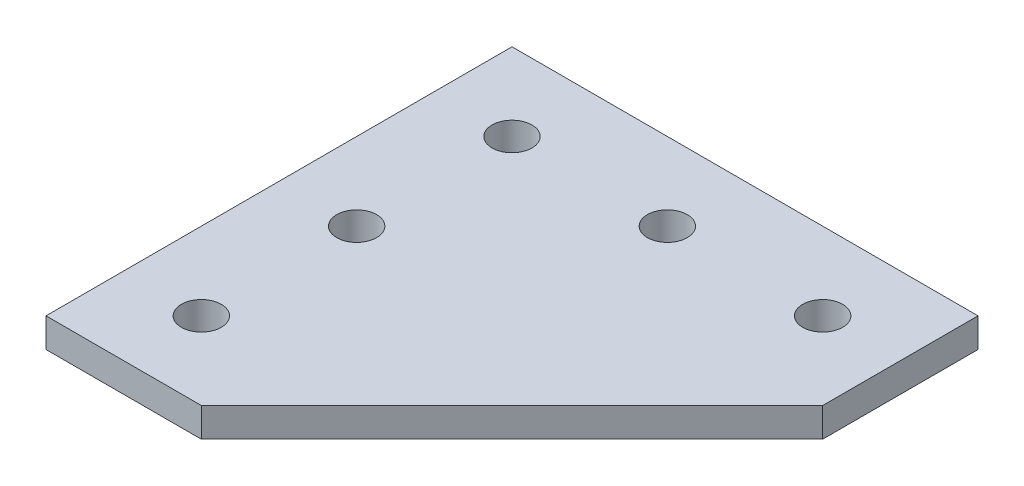
ISO-10303-21;
HEADER;
FILE_DESCRIPTION(('STEP AP214'),'2;1');
FILE_NAME('part.step','',(''),(''),'','','');
FILE_SCHEMA(('AUTOMOTIVE_DESIGN { 1 0 10303 214 1 1 1 1 }'));
ENDSEC;
DATA;
#1=APPLICATION_CONTEXT('core data for automotive mechanical design processes');
#2=APPLICATION_PROTOCOL_DEFINITION('international standard','automotive_design',2000,#1);
#3=PRODUCT_CONTEXT('',#1,'mechanical');
#4=PRODUCT('Part','Part','',(#3));
#5=PRODUCT_RELATED_PRODUCT_CATEGORY('part','',(#4));
#6=PRODUCT_DEFINITION_FORMATION('','',#4);
#7=PRODUCT_DEFINITION_CONTEXT('part definition',#1,'design');
#8=PRODUCT_DEFINITION('design','',#6,#7);
#9=PRODUCT_DEFINITION_SHAPE('','',#8);
#10=(LENGTH_UNIT() NAMED_UNIT(*) SI_UNIT(.MILLI.,.METRE.));
#11=(NAMED_UNIT(*) PLANE_ANGLE_UNIT() SI_UNIT($,.RADIAN.));
#12=(NAMED_UNIT(*) SI_UNIT($,.STERADIAN.) SOLID_ANGLE_UNIT());
#13=UNCERTAINTY_MEASURE_WITH_UNIT(LENGTH_MEASURE(1.E-05),#10,'distance_accuracy_value','');
#14=(GEOMETRIC_REPRESENTATION_CONTEXT(3) GLOBAL_UNCERTAINTY_ASSIGNED_CONTEXT((#13)) GLOBAL_UNIT_ASSIGNED_CONTEXT((#10,
#11,#12)) REPRESENTATION_CONTEXT('',''));
#15=CARTESIAN_POINT('',(0.,0.,0.));
#16=DIRECTION('',(0.,0.,1.));
#17=DIRECTION('',(1.,0.,0.));
#18=AXIS2_PLACEMENT_3D('',#15,#16,#17);
#19=CARTESIAN_POINT('',(0.,-4.7752,0.));
#20=DIRECTION('',(0.,0.,-1.));
#21=DIRECTION('',(-1.,0.,0.));
#22=AXIS2_PLACEMENT_3D('',#19,#20,#21);
#23=PLANE('',#22);
#24=DIRECTION('',(-1.,0.,0.));
#25=VECTOR('',#24,1.);
#26=CARTESIAN_POINT('',(0.,0.,0.));
#27=LINE('',#26,#25);
#28=CARTESIAN_POINT('',(0.,0.,0.));
#29=VERTEX_POINT('',#28);
#30=CARTESIAN_POINT('',(-76.2,0.,0.));
#31=VERTEX_POINT('',#30);
#32=EDGE_CURVE('E109',#29,#31,#27,.T.);
#33=ORIENTED_EDGE('',*,*,#32,.F.);
#34=DIRECTION('',(0.,1.,0.));
#35=VECTOR('',#34,1.);
#36=CARTESIAN_POINT('',(0.,-4.7752,0.));
#37=LINE('',#36,#35);
#38=CARTESIAN_POINT('',(0.,-4.7752,0.));
#39=VERTEX_POINT('',#38);
#40=EDGE_CURVE('E11',#39,#29,#37,.T.);
#41=ORIENTED_EDGE('',*,*,#40,.F.);
#42=DIRECTION('',(-1.,0.,0.));
#43=VECTOR('',#42,1.);
#44=CARTESIAN_POINT('',(0.,-4.7752,0.));
#45=LINE('',#44,#43);
#46=CARTESIAN_POINT('',(-76.2,-4.7752,0.));
#47=VERTEX_POINT('',#46);
#48=EDGE_CURVE('E104',#39,#47,#45,.T.);
#49=ORIENTED_EDGE('',*,*,#48,.T.);
#50=DIRECTION('',(0.,1.,0.));
#51=VECTOR('',#50,1.);
#52=CARTESIAN_POINT('',(-76.2,-4.7752,0.));
#53=LINE('',#52,#51);
#54=EDGE_CURVE('E35',#47,#31,#53,.T.);
#55=ORIENTED_EDGE('',*,*,#54,.T.);
#56=EDGE_LOOP('',(#33,#41,#49,#55));
#57=FACE_BOUND('',#56,.T.);
#58=ADVANCED_FACE('F32',(#57),#23,.T.);
#59=CARTESIAN_POINT('',(0.,-4.7752,25.4));
#60=DIRECTION('',(1.,0.,0.));
#61=DIRECTION('',(0.,0.,-1.));
#62=AXIS2_PLACEMENT_3D('',#59,#60,#61);
#63=PLANE('',#62);
#64=DIRECTION('',(0.,0.,-1.));
#65=VECTOR('',#64,1.);
#66=CARTESIAN_POINT('',(0.,0.,25.4));
#67=LINE('',#66,#65);
#68=CARTESIAN_POINT('',(0.,0.,25.4));
#69=VERTEX_POINT('',#68);
#70=EDGE_CURVE('E119',#69,#29,#67,.T.);
#71=ORIENTED_EDGE('',*,*,#70,.F.);
#72=DIRECTION('',(0.,1.,0.));
#73=VECTOR('',#72,1.);
#74=CARTESIAN_POINT('',(0.,-4.7752,25.4));
#75=LINE('',#74,#73);
#76=CARTESIAN_POINT('',(0.,-4.7752,25.4));
#77=VERTEX_POINT('',#76);
#78=EDGE_CURVE('E41',#77,#69,#75,.T.);
#79=ORIENTED_EDGE('',*,*,#78,.F.);
#80=DIRECTION('',(0.,0.,-1.));
#81=VECTOR('',#80,1.);
#82=CARTESIAN_POINT('',(0.,-4.7752,25.4));
#83=LINE('',#82,#81);
#84=EDGE_CURVE('E99',#77,#39,#83,.T.);
#85=ORIENTED_EDGE('',*,*,#84,.T.);
#86=ORIENTED_EDGE('',*,*,#40,.T.);
#87=EDGE_LOOP('',(#71,#79,#85,#86));
#88=FACE_BOUND('',#87,.T.);
#89=ADVANCED_FACE('F125',(#88),#63,.T.);
#90=CARTESIAN_POINT('',(-50.8,-4.7752,76.2));
#91=DIRECTION('',(0.707106781186547,0.,0.707106781186548));
#92=DIRECTION('',(0.707106781186548,0.,-0.707106781186547));
#93=AXIS2_PLACEMENT_3D('',#90,#91,#92);
#94=PLANE('',#93);
#95=DIRECTION('',(0.707106781186548,0.,-0.707106781186547));
#96=VECTOR('',#95,1.);
#97=CARTESIAN_POINT('',(-50.8,0.,76.2));
#98=LINE('',#97,#96);
#99=CARTESIAN_POINT('',(-50.8,0.,76.2));
#100=VERTEX_POINT('',#99);
#101=EDGE_CURVE('E88',#100,#69,#98,.T.);
#102=ORIENTED_EDGE('',*,*,#101,.F.);
#103=DIRECTION('',(0.,1.,0.));
#104=VECTOR('',#103,1.);
#105=CARTESIAN_POINT('',(-50.8,-4.7752,76.2));
#106=LINE('',#105,#104);
#107=CARTESIAN_POINT('',(-50.8,-4.7752,76.2));
#108=VERTEX_POINT('',#107);
#109=EDGE_CURVE('E83',#108,#100,#106,.T.);
#110=ORIENTED_EDGE('',*,*,#109,.F.);
#111=DIRECTION('',(0.707106781186548,0.,-0.707106781186547));
#112=VECTOR('',#111,1.);
#113=CARTESIAN_POINT('',(-50.8,-4.7752,76.2));
#114=LINE('',#113,#112);
#115=EDGE_CURVE('E86',#108,#77,#114,.T.);
#116=ORIENTED_EDGE('',*,*,#115,.T.);
#117=ORIENTED_EDGE('',*,*,#78,.T.);
#118=EDGE_LOOP('',(#102,#110,#116,#117));
#119=FACE_BOUND('',#118,.T.);
#120=ADVANCED_FACE('F85',(#119),#94,.T.);
#121=CARTESIAN_POINT('',(-76.2,-4.7752,76.2));
#122=DIRECTION('',(0.,0.,1.));
#123=DIRECTION('',(1.,0.,0.));
#124=AXIS2_PLACEMENT_3D('',#121,#122,#123);
#125=PLANE('',#124);
#126=DIRECTION('',(1.,0.,0.));
#127=VECTOR('',#126,1.);
#128=CARTESIAN_POINT('',(-76.2,0.,76.2));
#129=LINE('',#128,#127);
#130=CARTESIAN_POINT('',(-76.2,0.,76.2));
#131=VERTEX_POINT('',#130);
#132=EDGE_CURVE('E116',#131,#100,#129,.T.);
#133=ORIENTED_EDGE('',*,*,#132,.F.);
#134=DIRECTION('',(0.,1.,0.));
#135=VECTOR('',#134,1.);
#136=CARTESIAN_POINT('',(-76.2,-4.7752,76.2));
#137=LINE('',#136,#135);
#138=CARTESIAN_POINT('',(-76.2,-4.7752,76.2));
#139=VERTEX_POINT('',#138);
#140=EDGE_CURVE('E93',#139,#131,#137,.T.);
#141=ORIENTED_EDGE('',*,*,#140,.F.);
#142=DIRECTION('',(1.,0.,0.));
#143=VECTOR('',#142,1.);
#144=CARTESIAN_POINT('',(-76.2,-4.7752,76.2));
#145=LINE('',#144,#143);
#146=EDGE_CURVE('E98',#139,#108,#145,.T.);
#147=ORIENTED_EDGE('',*,*,#146,.T.);
#148=ORIENTED_EDGE('',*,*,#109,.T.);
#149=EDGE_LOOP('',(#133,#141,#147,#148));
#150=FACE_BOUND('',#149,.T.);
#151=ADVANCED_FACE('F101',(#150),#125,.T.);
#152=CARTESIAN_POINT('',(-76.2,-4.7752,0.));
#153=DIRECTION('',(-1.,0.,0.));
#154=DIRECTION('',(0.,0.,1.));
#155=AXIS2_PLACEMENT_3D('',#152,#153,#154);
#156=PLANE('',#155);
#157=DIRECTION('',(0.,0.,1.));
#158=VECTOR('',#157,1.);
#159=CARTESIAN_POINT('',(-76.2,0.,0.));
#160=LINE('',#159,#158);
#161=EDGE_CURVE('E112',#31,#131,#160,.T.);
#162=ORIENTED_EDGE('',*,*,#161,.F.);
#163=ORIENTED_EDGE('',*,*,#54,.F.);
#164=DIRECTION('',(0.,0.,1.));
#165=VECTOR('',#164,1.);
#166=CARTESIAN_POINT('',(-76.2,-4.7752,0.));
#167=LINE('',#166,#165);
#168=EDGE_CURVE('E102',#47,#139,#167,.T.);
#169=ORIENTED_EDGE('',*,*,#168,.T.);
#170=ORIENTED_EDGE('',*,*,#140,.T.);
#171=EDGE_LOOP('',(#162,#163,#169,#170));
#172=FACE_BOUND('',#171,.T.);
#173=ADVANCED_FACE('F122',(#172),#156,.T.);
#174=CARTESIAN_POINT('',(0.,-4.7752,0.));
#175=DIRECTION('',(0.,1.,0.));
#176=DIRECTION('',(0.,0.,1.));
#177=AXIS2_PLACEMENT_3D('',#174,#175,#176);
#178=PLANE('',#177);
#179=CARTESIAN_POINT('',(-12.7,-4.7752,12.7));
#180=DIRECTION('',(0.,1.,0.));
#181=DIRECTION('',(0.,0.,-1.));
#182=AXIS2_PLACEMENT_3D('',#179,#180,#181);
#183=CIRCLE('',#182,3.2639);
#184=CARTESIAN_POINT('',(-12.7,-4.7752,9.4361));
#185=VERTEX_POINT('',#184);
#186=EDGE_CURVE('E172',#185,#185,#183,.T.);
#187=ORIENTED_EDGE('',*,*,#186,.T.);
#188=EDGE_LOOP('',(#187));
#189=FACE_BOUND('',#188,.T.);
#190=CARTESIAN_POINT('',(-38.1,-4.7752,12.7));
#191=DIRECTION('',(0.,1.,0.));
#192=DIRECTION('',(0.,0.,-1.));
#193=AXIS2_PLACEMENT_3D('',#190,#191,#192);
#194=CIRCLE('',#193,3.2639);
#195=CARTESIAN_POINT('',(-38.1,-4.7752,9.4361));
#196=VERTEX_POINT('',#195);
#197=EDGE_CURVE('E180',#196,#196,#194,.T.);
#198=ORIENTED_EDGE('',*,*,#197,.T.);
#199=EDGE_LOOP('',(#198));
#200=FACE_BOUND('',#199,.T.);
#201=CARTESIAN_POINT('',(-63.5,-4.7752,12.7));
#202=DIRECTION('',(0.,1.,0.));
#203=DIRECTION('',(0.,0.,-1.));
#204=AXIS2_PLACEMENT_3D('',#201,#202,#203);
#205=CIRCLE('',#204,3.2639);
#206=CARTESIAN_POINT('',(-63.5,-4.7752,9.43609999999999));
#207=VERTEX_POINT('',#206);
#208=EDGE_CURVE('E186',#207,#207,#205,.T.);
#209=ORIENTED_EDGE('',*,*,#208,.T.);
#210=EDGE_LOOP('',(#209));
#211=FACE_BOUND('',#210,.T.);
#212=CARTESIAN_POINT('',(-63.5,-4.7752,38.1));
#213=DIRECTION('',(0.,1.,0.));
#214=DIRECTION('',(0.,0.,-1.));
#215=AXIS2_PLACEMENT_3D('',#212,#213,#214);
#216=CIRCLE('',#215,3.2639);
#217=CARTESIAN_POINT('',(-63.5,-4.7752,34.8361));
#218=VERTEX_POINT('',#217);
#219=EDGE_CURVE('E192',#218,#218,#216,.T.);
#220=ORIENTED_EDGE('',*,*,#219,.T.);
#221=EDGE_LOOP('',(#220));
#222=FACE_BOUND('',#221,.T.);
#223=CARTESIAN_POINT('',(-63.5,-4.7752,63.5));
#224=DIRECTION('',(0.,1.,0.));
#225=DIRECTION('',(0.,0.,-1.));
#226=AXIS2_PLACEMENT_3D('',#223,#224,#225);
#227=CIRCLE('',#226,3.26390000000001);
#228=CARTESIAN_POINT('',(-63.5,-4.7752,60.2361));
#229=VERTEX_POINT('',#228);
#230=EDGE_CURVE('E113',#229,#229,#227,.T.);
#231=ORIENTED_EDGE('',*,*,#230,.T.);
#232=EDGE_LOOP('',(#231));
#233=FACE_BOUND('',#232,.T.);
#234=ORIENTED_EDGE('',*,*,#48,.F.);
#235=ORIENTED_EDGE('',*,*,#84,.F.);
#236=ORIENTED_EDGE('',*,*,#115,.F.);
#237=ORIENTED_EDGE('',*,*,#146,.F.);
#238=ORIENTED_EDGE('',*,*,#168,.F.);
#239=EDGE_LOOP('',(#234,#235,#236,#237,#238));
#240=FACE_BOUND('',#239,.T.);
#241=ADVANCED_FACE('F97',(#189,#200,#211,#222,#233,#240),#178,.F.);
#242=CARTESIAN_POINT('',(0.,0.,0.));
#243=DIRECTION('',(0.,1.,0.));
#244=DIRECTION('',(0.,0.,1.));
#245=AXIS2_PLACEMENT_3D('',#242,#243,#244);
#246=PLANE('',#245);
#247=CARTESIAN_POINT('',(-12.7,0.,12.7));
#248=DIRECTION('',(0.,1.,0.));
#249=DIRECTION('',(0.,0.,-1.));
#250=AXIS2_PLACEMENT_3D('',#247,#248,#249);
#251=CIRCLE('',#250,3.2639);
#252=CARTESIAN_POINT('',(-12.7,0.,9.4361));
#253=VERTEX_POINT('',#252);
#254=EDGE_CURVE('E175',#253,#253,#251,.T.);
#255=ORIENTED_EDGE('',*,*,#254,.F.);
#256=EDGE_LOOP('',(#255));
#257=FACE_BOUND('',#256,.T.);
#258=CARTESIAN_POINT('',(-38.1,0.,12.7));
#259=DIRECTION('',(0.,1.,0.));
#260=DIRECTION('',(0.,0.,-1.));
#261=AXIS2_PLACEMENT_3D('',#258,#259,#260);
#262=CIRCLE('',#261,3.2639);
#263=CARTESIAN_POINT('',(-38.1,0.,9.4361));
#264=VERTEX_POINT('',#263);
#265=EDGE_CURVE('E177',#264,#264,#262,.T.);
#266=ORIENTED_EDGE('',*,*,#265,.F.);
#267=EDGE_LOOP('',(#266));
#268=FACE_BOUND('',#267,.T.);
#269=CARTESIAN_POINT('',(-63.5,0.,12.7));
#270=DIRECTION('',(0.,1.,0.));
#271=DIRECTION('',(0.,0.,-1.));
#272=AXIS2_PLACEMENT_3D('',#269,#270,#271);
#273=CIRCLE('',#272,3.2639);
#274=CARTESIAN_POINT('',(-63.5,0.,9.43609999999999));
#275=VERTEX_POINT('',#274);
#276=EDGE_CURVE('E183',#275,#275,#273,.T.);
#277=ORIENTED_EDGE('',*,*,#276,.F.);
#278=EDGE_LOOP('',(#277));
#279=FACE_BOUND('',#278,.T.);
#280=CARTESIAN_POINT('',(-63.5,0.,38.1));
#281=DIRECTION('',(0.,1.,0.));
#282=DIRECTION('',(0.,0.,-1.));
#283=AXIS2_PLACEMENT_3D('',#280,#281,#282);
#284=CIRCLE('',#283,3.2639);
#285=CARTESIAN_POINT('',(-63.5,0.,34.8361));
#286=VERTEX_POINT('',#285);
#287=EDGE_CURVE('E189',#286,#286,#284,.T.);
#288=ORIENTED_EDGE('',*,*,#287,.F.);
#289=EDGE_LOOP('',(#288));
#290=FACE_BOUND('',#289,.T.);
#291=CARTESIAN_POINT('',(-63.5,0.,63.5));
#292=DIRECTION('',(0.,1.,0.));
#293=DIRECTION('',(0.,0.,-1.));
#294=AXIS2_PLACEMENT_3D('',#291,#292,#293);
#295=CIRCLE('',#294,3.26390000000001);
#296=CARTESIAN_POINT('',(-63.5,0.,60.2361));
#297=VERTEX_POINT('',#296);
#298=EDGE_CURVE('E195',#297,#297,#295,.T.);
#299=ORIENTED_EDGE('',*,*,#298,.F.);
#300=EDGE_LOOP('',(#299));
#301=FACE_BOUND('',#300,.T.);
#302=ORIENTED_EDGE('',*,*,#32,.T.);
#303=ORIENTED_EDGE('',*,*,#161,.T.);
#304=ORIENTED_EDGE('',*,*,#132,.T.);
#305=ORIENTED_EDGE('',*,*,#101,.T.);
#306=ORIENTED_EDGE('',*,*,#70,.T.);
#307=EDGE_LOOP('',(#302,#303,#304,#305,#306));
#308=FACE_BOUND('',#307,.T.);
#309=ADVANCED_FACE('F124',(#257,#268,#279,#290,#301,#308),#246,.T.);
#310=CARTESIAN_POINT('',(-63.5,-4.7752,63.5));
#311=DIRECTION('',(0.,1.,0.));
#312=DIRECTION('',(0.,0.,1.));
#313=AXIS2_PLACEMENT_3D('',#310,#311,#312);
#314=CYLINDRICAL_SURFACE('',#313,3.26390000000001);
#315=ORIENTED_EDGE('',*,*,#230,.F.);
#316=EDGE_LOOP('',(#315));
#317=FACE_BOUND('',#316,.T.);
#318=ORIENTED_EDGE('',*,*,#298,.T.);
#319=EDGE_LOOP('',(#318));
#320=FACE_BOUND('',#319,.T.);
#321=ADVANCED_FACE('F145',(#317,#320),#314,.F.);
#322=CARTESIAN_POINT('',(-63.5,-4.7752,38.1));
#323=DIRECTION('',(0.,1.,0.));
#324=DIRECTION('',(0.,0.,1.));
#325=AXIS2_PLACEMENT_3D('',#322,#323,#324);
#326=CYLINDRICAL_SURFACE('',#325,3.2639);
#327=ORIENTED_EDGE('',*,*,#219,.F.);
#328=EDGE_LOOP('',(#327));
#329=FACE_BOUND('',#328,.T.);
#330=ORIENTED_EDGE('',*,*,#287,.T.);
#331=EDGE_LOOP('',(#330));
#332=FACE_BOUND('',#331,.T.);
#333=ADVANCED_FACE('F152',(#329,#332),#326,.F.);
#334=CARTESIAN_POINT('',(-63.5,-4.7752,12.7));
#335=DIRECTION('',(0.,1.,0.));
#336=DIRECTION('',(0.,0.,1.));
#337=AXIS2_PLACEMENT_3D('',#334,#335,#336);
#338=CYLINDRICAL_SURFACE('',#337,3.2639);
#339=ORIENTED_EDGE('',*,*,#208,.F.);
#340=EDGE_LOOP('',(#339));
#341=FACE_BOUND('',#340,.T.);
#342=ORIENTED_EDGE('',*,*,#276,.T.);
#343=EDGE_LOOP('',(#342));
#344=FACE_BOUND('',#343,.T.);
#345=ADVANCED_FACE('F156',(#341,#344),#338,.F.);
#346=CARTESIAN_POINT('',(-38.1,-4.7752,12.7));
#347=DIRECTION('',(0.,1.,0.));
#348=DIRECTION('',(0.,0.,1.));
#349=AXIS2_PLACEMENT_3D('',#346,#347,#348);
#350=CYLINDRICAL_SURFACE('',#349,3.2639);
#351=ORIENTED_EDGE('',*,*,#197,.F.);
#352=EDGE_LOOP('',(#351));
#353=FACE_BOUND('',#352,.T.);
#354=ORIENTED_EDGE('',*,*,#265,.T.);
#355=EDGE_LOOP('',(#354));
#356=FACE_BOUND('',#355,.T.);
#357=ADVANCED_FACE('F160',(#353,#356),#350,.F.);
#358=CARTESIAN_POINT('',(-12.7,-4.7752,12.7));
#359=DIRECTION('',(0.,1.,0.));
#360=DIRECTION('',(0.,0.,1.));
#361=AXIS2_PLACEMENT_3D('',#358,#359,#360);
#362=CYLINDRICAL_SURFACE('',#361,3.2639);
#363=ORIENTED_EDGE('',*,*,#186,.F.);
#364=EDGE_LOOP('',(#363));
#365=FACE_BOUND('',#364,.T.);
#366=ORIENTED_EDGE('',*,*,#254,.T.);
#367=EDGE_LOOP('',(#366));
#368=FACE_BOUND('',#367,.T.);
#369=ADVANCED_FACE('F164',(#365,#368),#362,.F.);
#370=CLOSED_SHELL('',(#58,#89,#120,#151,#173,#241,#309,#321,#333,#345,#357,#369));
#371=MANIFOLD_SOLID_BREP('B2',#370);
#372=ADVANCED_BREP_SHAPE_REPRESENTATION('',(#18,#371),#14);
#373=SHAPE_DEFINITION_REPRESENTATION(#9,#372);
ENDSEC;
END-ISO-10303-21;
